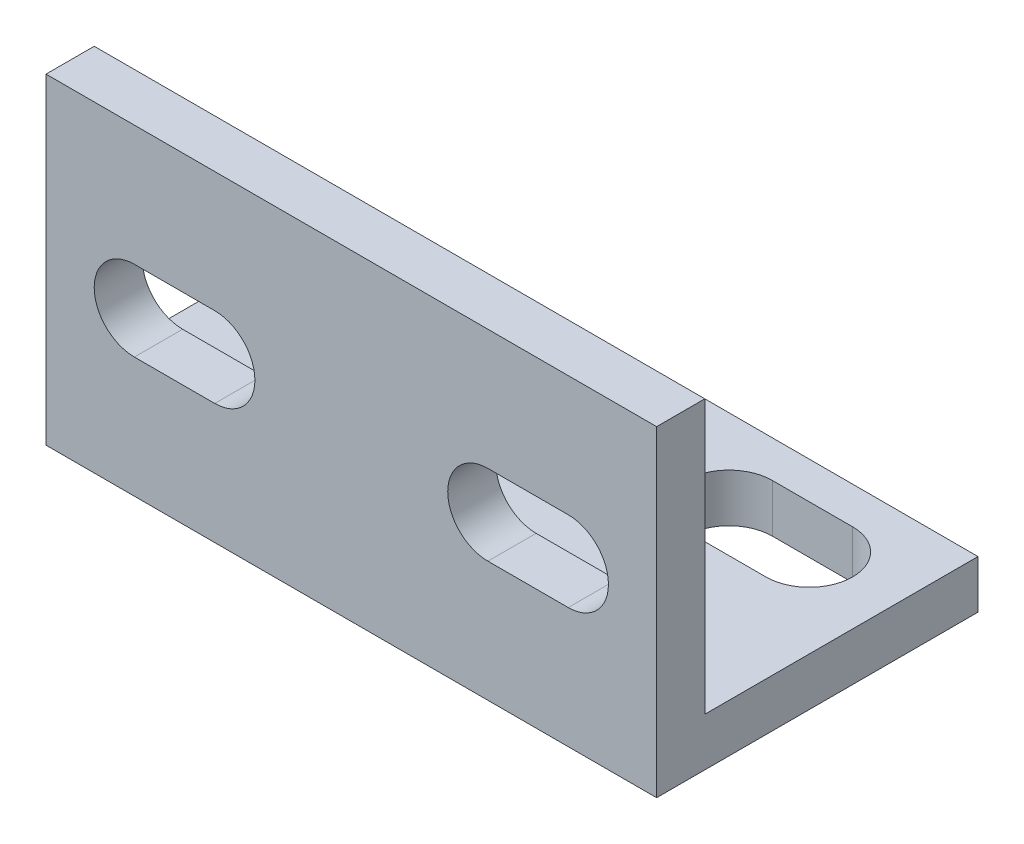
ISO-10303-21;
HEADER;
FILE_DESCRIPTION(('STEP AP214'),'2;1');
FILE_NAME('part.step','',(''),(''),'','','');
FILE_SCHEMA(('AUTOMOTIVE_DESIGN { 1 0 10303 214 1 1 1 1 }'));
ENDSEC;
DATA;
#1=APPLICATION_CONTEXT('core data for automotive mechanical design processes');
#2=APPLICATION_PROTOCOL_DEFINITION('international standard','automotive_design',2000,#1);
#3=PRODUCT_CONTEXT('',#1,'mechanical');
#4=PRODUCT('Part','Part','',(#3));
#5=PRODUCT_RELATED_PRODUCT_CATEGORY('part','',(#4));
#6=PRODUCT_DEFINITION_FORMATION('','',#4);
#7=PRODUCT_DEFINITION_CONTEXT('part definition',#1,'design');
#8=PRODUCT_DEFINITION('design','',#6,#7);
#9=PRODUCT_DEFINITION_SHAPE('','',#8);
#10=(LENGTH_UNIT() NAMED_UNIT(*) SI_UNIT(.MILLI.,.METRE.));
#11=(NAMED_UNIT(*) PLANE_ANGLE_UNIT() SI_UNIT($,.RADIAN.));
#12=(NAMED_UNIT(*) SI_UNIT($,.STERADIAN.) SOLID_ANGLE_UNIT());
#13=UNCERTAINTY_MEASURE_WITH_UNIT(LENGTH_MEASURE(1.E-05),#10,'distance_accuracy_value','');
#14=(GEOMETRIC_REPRESENTATION_CONTEXT(3) GLOBAL_UNCERTAINTY_ASSIGNED_CONTEXT((#13)) GLOBAL_UNIT_ASSIGNED_CONTEXT((#10,
#11,#12)) REPRESENTATION_CONTEXT('',''));
#15=CARTESIAN_POINT('',(0.,0.,0.));
#16=DIRECTION('',(0.,0.,1.));
#17=DIRECTION('',(1.,0.,0.));
#18=AXIS2_PLACEMENT_3D('',#15,#16,#17);
#19=CARTESIAN_POINT('',(38.,0.,0.));
#20=DIRECTION('',(0.,0.,1.));
#21=DIRECTION('',(1.,0.,0.));
#22=AXIS2_PLACEMENT_3D('',#19,#20,#21);
#23=PLANE('',#22);
#24=DIRECTION('',(0.,1.,0.));
#25=VECTOR('',#24,1.);
#26=CARTESIAN_POINT('',(0.,0.,0.));
#27=LINE('',#26,#25);
#28=CARTESIAN_POINT('',(0.,-3.,0.));
#29=VERTEX_POINT('',#28);
#30=CARTESIAN_POINT('',(0.,0.,0.));
#31=VERTEX_POINT('',#30);
#32=EDGE_CURVE('E249',#29,#31,#27,.T.);
#33=ORIENTED_EDGE('',*,*,#32,.T.);
#34=DIRECTION('',(-1.,0.,0.));
#35=VECTOR('',#34,1.);
#36=CARTESIAN_POINT('',(38.,0.,0.));
#37=LINE('',#36,#35);
#38=CARTESIAN_POINT('',(38.,0.,0.));
#39=VERTEX_POINT('',#38);
#40=EDGE_CURVE('E314',#39,#31,#37,.T.);
#41=ORIENTED_EDGE('',*,*,#40,.F.);
#42=DIRECTION('',(0.,1.,0.));
#43=VECTOR('',#42,1.);
#44=CARTESIAN_POINT('',(38.,0.,0.));
#45=LINE('',#44,#43);
#46=CARTESIAN_POINT('',(38.,-3.,0.));
#47=VERTEX_POINT('',#46);
#48=EDGE_CURVE('E274',#47,#39,#45,.T.);
#49=ORIENTED_EDGE('',*,*,#48,.F.);
#50=DIRECTION('',(-1.,0.,0.));
#51=VECTOR('',#50,1.);
#52=CARTESIAN_POINT('',(38.,-3.,0.));
#53=LINE('',#52,#51);
#54=EDGE_CURVE('E288',#47,#29,#53,.T.);
#55=ORIENTED_EDGE('',*,*,#54,.T.);
#56=EDGE_LOOP('',(#33,#41,#49,#55));
#57=FACE_BOUND('',#56,.T.);
#58=ADVANCED_FACE('F34',(#57),#23,.F.);
#59=CARTESIAN_POINT('',(38.,0.,0.));
#60=DIRECTION('',(0.,-1.,0.));
#61=DIRECTION('',(0.,0.,-1.));
#62=AXIS2_PLACEMENT_3D('',#59,#60,#61);
#63=PLANE('',#62);
#64=DIRECTION('',(1.,0.,0.));
#65=VECTOR('',#64,1.);
#66=CARTESIAN_POINT('',(5.5,0.,7.7));
#67=LINE('',#66,#65);
#68=CARTESIAN_POINT('',(5.5,0.,7.7));
#69=VERTEX_POINT('',#68);
#70=CARTESIAN_POINT('',(10.5,0.,7.7));
#71=VERTEX_POINT('',#70);
#72=EDGE_CURVE('E236',#69,#71,#67,.T.);
#73=ORIENTED_EDGE('',*,*,#72,.F.);
#74=CARTESIAN_POINT('',(5.5,0.,5.));
#75=DIRECTION('',(0.,1.,0.));
#76=DIRECTION('',(0.,0.,1.));
#77=AXIS2_PLACEMENT_3D('',#74,#75,#76);
#78=CIRCLE('',#77,2.7);
#79=CARTESIAN_POINT('',(5.5,0.,2.3));
#80=VERTEX_POINT('',#79);
#81=EDGE_CURVE('E234',#80,#69,#78,.T.);
#82=ORIENTED_EDGE('',*,*,#81,.F.);
#83=DIRECTION('',(-1.,0.,0.));
#84=VECTOR('',#83,1.);
#85=CARTESIAN_POINT('',(5.5,0.,2.3));
#86=LINE('',#85,#84);
#87=CARTESIAN_POINT('',(10.5,0.,2.3));
#88=VERTEX_POINT('',#87);
#89=EDGE_CURVE('E243',#88,#80,#86,.T.);
#90=ORIENTED_EDGE('',*,*,#89,.F.);
#91=CARTESIAN_POINT('',(10.5,0.,5.));
#92=DIRECTION('',(0.,1.,0.));
#93=DIRECTION('',(0.,0.,1.));
#94=AXIS2_PLACEMENT_3D('',#91,#92,#93);
#95=CIRCLE('',#94,2.7);
#96=EDGE_CURVE('E240',#71,#88,#95,.T.);
#97=ORIENTED_EDGE('',*,*,#96,.F.);
#98=EDGE_LOOP('',(#73,#82,#90,#97));
#99=FACE_BOUND('',#98,.T.);
#100=DIRECTION('',(-1.,0.,0.));
#101=VECTOR('',#100,1.);
#102=CARTESIAN_POINT('',(32.5,0.,2.3));
#103=LINE('',#102,#101);
#104=CARTESIAN_POINT('',(32.5,0.,2.3));
#105=VERTEX_POINT('',#104);
#106=CARTESIAN_POINT('',(27.5,0.,2.3));
#107=VERTEX_POINT('',#106);
#108=EDGE_CURVE('E257',#105,#107,#103,.T.);
#109=ORIENTED_EDGE('',*,*,#108,.F.);
#110=CARTESIAN_POINT('',(32.5,0.,5.));
#111=DIRECTION('',(0.,1.,0.));
#112=DIRECTION('',(0.,0.,-1.));
#113=AXIS2_PLACEMENT_3D('',#110,#111,#112);
#114=CIRCLE('',#113,2.7);
#115=CARTESIAN_POINT('',(32.5,0.,7.7));
#116=VERTEX_POINT('',#115);
#117=EDGE_CURVE('E213',#116,#105,#114,.T.);
#118=ORIENTED_EDGE('',*,*,#117,.F.);
#119=DIRECTION('',(1.,0.,0.));
#120=VECTOR('',#119,1.);
#121=CARTESIAN_POINT('',(32.5,0.,7.7));
#122=LINE('',#121,#120);
#123=CARTESIAN_POINT('',(27.5,0.,7.7));
#124=VERTEX_POINT('',#123);
#125=EDGE_CURVE('E263',#124,#116,#122,.T.);
#126=ORIENTED_EDGE('',*,*,#125,.F.);
#127=CARTESIAN_POINT('',(27.5,0.,5.));
#128=DIRECTION('',(0.,1.,0.));
#129=DIRECTION('',(0.,0.,-1.));
#130=AXIS2_PLACEMENT_3D('',#127,#128,#129);
#131=CIRCLE('',#130,2.7);
#132=EDGE_CURVE('E260',#107,#124,#131,.T.);
#133=ORIENTED_EDGE('',*,*,#132,.F.);
#134=EDGE_LOOP('',(#109,#118,#126,#133));
#135=FACE_BOUND('',#134,.T.);
#136=DIRECTION('',(0.,0.,1.));
#137=VECTOR('',#136,1.);
#138=CARTESIAN_POINT('',(0.,0.,0.));
#139=LINE('',#138,#137);
#140=CARTESIAN_POINT('',(0.,0.,17.));
#141=VERTEX_POINT('',#140);
#142=EDGE_CURVE('E291',#31,#141,#139,.T.);
#143=ORIENTED_EDGE('',*,*,#142,.T.);
#144=DIRECTION('',(-1.,0.,0.));
#145=VECTOR('',#144,1.);
#146=CARTESIAN_POINT('',(38.,0.,17.));
#147=LINE('',#146,#145);
#148=CARTESIAN_POINT('',(38.,0.,17.));
#149=VERTEX_POINT('',#148);
#150=EDGE_CURVE('E311',#149,#141,#147,.T.);
#151=ORIENTED_EDGE('',*,*,#150,.F.);
#152=DIRECTION('',(0.,0.,1.));
#153=VECTOR('',#152,1.);
#154=CARTESIAN_POINT('',(38.,0.,0.));
#155=LINE('',#154,#153);
#156=EDGE_CURVE('E277',#39,#149,#155,.T.);
#157=ORIENTED_EDGE('',*,*,#156,.F.);
#158=ORIENTED_EDGE('',*,*,#40,.T.);
#159=EDGE_LOOP('',(#143,#151,#157,#158));
#160=FACE_BOUND('',#159,.T.);
#161=ADVANCED_FACE('F377',(#99,#135,#160),#63,.F.);
#162=CARTESIAN_POINT('',(38.,0.,17.));
#163=DIRECTION('',(0.,0.,1.));
#164=DIRECTION('',(1.,0.,0.));
#165=AXIS2_PLACEMENT_3D('',#162,#163,#164);
#166=PLANE('',#165);
#167=DIRECTION('',(-1.,0.,0.));
#168=VECTOR('',#167,1.);
#169=CARTESIAN_POINT('',(32.5,4.49999999999999,17.));
#170=LINE('',#169,#168);
#171=CARTESIAN_POINT('',(32.5,4.49999999999999,17.));
#172=VERTEX_POINT('',#171);
#173=CARTESIAN_POINT('',(27.5,4.49999999999999,17.));
#174=VERTEX_POINT('',#173);
#175=EDGE_CURVE('E199',#172,#174,#170,.T.);
#176=ORIENTED_EDGE('',*,*,#175,.F.);
#177=CARTESIAN_POINT('',(32.5,6.99999999999999,17.));
#178=DIRECTION('',(0.,0.,-1.));
#179=DIRECTION('',(-1.,0.,0.));
#180=AXIS2_PLACEMENT_3D('',#177,#178,#179);
#181=CIRCLE('',#180,2.5);
#182=CARTESIAN_POINT('',(32.5,9.49999999999999,17.));
#183=VERTEX_POINT('',#182);
#184=EDGE_CURVE('E48',#183,#172,#181,.T.);
#185=ORIENTED_EDGE('',*,*,#184,.F.);
#186=DIRECTION('',(1.,0.,0.));
#187=VECTOR('',#186,1.);
#188=CARTESIAN_POINT('',(32.5,9.49999999999999,17.));
#189=LINE('',#188,#187);
#190=CARTESIAN_POINT('',(27.5,9.49999999999999,17.));
#191=VERTEX_POINT('',#190);
#192=EDGE_CURVE('E206',#191,#183,#189,.T.);
#193=ORIENTED_EDGE('',*,*,#192,.F.);
#194=CARTESIAN_POINT('',(27.5,6.99999999999999,17.));
#195=DIRECTION('',(0.,0.,-1.));
#196=DIRECTION('',(-1.,0.,0.));
#197=AXIS2_PLACEMENT_3D('',#194,#195,#196);
#198=CIRCLE('',#197,2.5);
#199=EDGE_CURVE('E189',#174,#191,#198,.T.);
#200=ORIENTED_EDGE('',*,*,#199,.F.);
#201=EDGE_LOOP('',(#176,#185,#193,#200));
#202=FACE_BOUND('',#201,.T.);
#203=DIRECTION('',(1.,0.,0.));
#204=VECTOR('',#203,1.);
#205=CARTESIAN_POINT('',(5.5,9.49999999999999,17.));
#206=LINE('',#205,#204);
#207=CARTESIAN_POINT('',(5.5,9.49999999999999,17.));
#208=VERTEX_POINT('',#207);
#209=CARTESIAN_POINT('',(10.5,9.49999999999999,17.));
#210=VERTEX_POINT('',#209);
#211=EDGE_CURVE('E217',#208,#210,#206,.T.);
#212=ORIENTED_EDGE('',*,*,#211,.F.);
#213=CARTESIAN_POINT('',(5.5,6.99999999999999,17.));
#214=DIRECTION('',(0.,0.,-1.));
#215=DIRECTION('',(1.,0.,0.));
#216=AXIS2_PLACEMENT_3D('',#213,#214,#215);
#217=CIRCLE('',#216,2.5);
#218=CARTESIAN_POINT('',(5.5,4.49999999999999,17.));
#219=VERTEX_POINT('',#218);
#220=EDGE_CURVE('E56',#219,#208,#217,.T.);
#221=ORIENTED_EDGE('',*,*,#220,.F.);
#222=DIRECTION('',(-1.,0.,0.));
#223=VECTOR('',#222,1.);
#224=CARTESIAN_POINT('',(5.5,4.49999999999999,17.));
#225=LINE('',#224,#223);
#226=CARTESIAN_POINT('',(10.5,4.49999999999999,17.));
#227=VERTEX_POINT('',#226);
#228=EDGE_CURVE('E223',#227,#219,#225,.T.);
#229=ORIENTED_EDGE('',*,*,#228,.F.);
#230=CARTESIAN_POINT('',(10.5,6.99999999999999,17.));
#231=DIRECTION('',(0.,0.,-1.));
#232=DIRECTION('',(1.,0.,0.));
#233=AXIS2_PLACEMENT_3D('',#230,#231,#232);
#234=CIRCLE('',#233,2.5);
#235=EDGE_CURVE('E220',#210,#227,#234,.T.);
#236=ORIENTED_EDGE('',*,*,#235,.F.);
#237=EDGE_LOOP('',(#212,#221,#229,#236));
#238=FACE_BOUND('',#237,.T.);
#239=DIRECTION('',(0.,1.,0.));
#240=VECTOR('',#239,1.);
#241=CARTESIAN_POINT('',(0.,0.,17.));
#242=LINE('',#241,#240);
#243=CARTESIAN_POINT('',(0.,17.,17.));
#244=VERTEX_POINT('',#243);
#245=EDGE_CURVE('E293',#141,#244,#242,.T.);
#246=ORIENTED_EDGE('',*,*,#245,.T.);
#247=DIRECTION('',(-1.,0.,0.));
#248=VECTOR('',#247,1.);
#249=CARTESIAN_POINT('',(38.,17.,17.));
#250=LINE('',#249,#248);
#251=CARTESIAN_POINT('',(38.,17.,17.));
#252=VERTEX_POINT('',#251);
#253=EDGE_CURVE('E308',#252,#244,#250,.T.);
#254=ORIENTED_EDGE('',*,*,#253,.F.);
#255=DIRECTION('',(0.,1.,0.));
#256=VECTOR('',#255,1.);
#257=CARTESIAN_POINT('',(38.,0.,17.));
#258=LINE('',#257,#256);
#259=EDGE_CURVE('E280',#149,#252,#258,.T.);
#260=ORIENTED_EDGE('',*,*,#259,.F.);
#261=ORIENTED_EDGE('',*,*,#150,.T.);
#262=EDGE_LOOP('',(#246,#254,#260,#261));
#263=FACE_BOUND('',#262,.T.);
#264=ADVANCED_FACE('F203',(#202,#238,#263),#166,.F.);
#265=CARTESIAN_POINT('',(38.,17.,17.));
#266=DIRECTION('',(0.,-1.,0.));
#267=DIRECTION('',(0.,0.,-1.));
#268=AXIS2_PLACEMENT_3D('',#265,#266,#267);
#269=PLANE('',#268);
#270=DIRECTION('',(0.,0.,1.));
#271=VECTOR('',#270,1.);
#272=CARTESIAN_POINT('',(0.,17.,17.));
#273=LINE('',#272,#271);
#274=CARTESIAN_POINT('',(0.,17.,20.));
#275=VERTEX_POINT('',#274);
#276=EDGE_CURVE('E295',#244,#275,#273,.T.);
#277=ORIENTED_EDGE('',*,*,#276,.T.);
#278=DIRECTION('',(-1.,0.,0.));
#279=VECTOR('',#278,1.);
#280=CARTESIAN_POINT('',(38.,17.,20.));
#281=LINE('',#280,#279);
#282=CARTESIAN_POINT('',(38.,17.,20.));
#283=VERTEX_POINT('',#282);
#284=EDGE_CURVE('E305',#283,#275,#281,.T.);
#285=ORIENTED_EDGE('',*,*,#284,.F.);
#286=DIRECTION('',(0.,0.,1.));
#287=VECTOR('',#286,1.);
#288=CARTESIAN_POINT('',(38.,17.,17.));
#289=LINE('',#288,#287);
#290=EDGE_CURVE('E282',#252,#283,#289,.T.);
#291=ORIENTED_EDGE('',*,*,#290,.F.);
#292=ORIENTED_EDGE('',*,*,#253,.T.);
#293=EDGE_LOOP('',(#277,#285,#291,#292));
#294=FACE_BOUND('',#293,.T.);
#295=ADVANCED_FACE('F406',(#294),#269,.F.);
#296=CARTESIAN_POINT('',(38.,17.,20.));
#297=DIRECTION('',(0.,0.,-1.));
#298=DIRECTION('',(0.,1.,0.));
#299=AXIS2_PLACEMENT_3D('',#296,#297,#298);
#300=PLANE('',#299);
#301=DIRECTION('',(1.,0.,0.));
#302=VECTOR('',#301,1.);
#303=CARTESIAN_POINT('',(38.,9.49999999999999,20.));
#304=LINE('',#303,#302);
#305=CARTESIAN_POINT('',(27.5,9.49999999999999,20.));
#306=VERTEX_POINT('',#305);
#307=CARTESIAN_POINT('',(32.5,9.49999999999999,20.));
#308=VERTEX_POINT('',#307);
#309=EDGE_CURVE('E41',#306,#308,#304,.T.);
#310=ORIENTED_EDGE('',*,*,#309,.T.);
#311=CARTESIAN_POINT('',(32.5,6.99999999999999,20.));
#312=DIRECTION('',(0.,0.,-1.));
#313=DIRECTION('',(0.,1.,0.));
#314=AXIS2_PLACEMENT_3D('',#311,#312,#313);
#315=CIRCLE('',#314,2.5);
#316=CARTESIAN_POINT('',(32.5,4.49999999999999,20.));
#317=VERTEX_POINT('',#316);
#318=EDGE_CURVE('E11',#308,#317,#315,.T.);
#319=ORIENTED_EDGE('',*,*,#318,.T.);
#320=DIRECTION('',(-1.,0.,0.));
#321=VECTOR('',#320,1.);
#322=CARTESIAN_POINT('',(38.,4.49999999999999,20.));
#323=LINE('',#322,#321);
#324=CARTESIAN_POINT('',(27.5,4.49999999999999,20.));
#325=VERTEX_POINT('',#324);
#326=EDGE_CURVE('E353',#317,#325,#323,.T.);
#327=ORIENTED_EDGE('',*,*,#326,.T.);
#328=CARTESIAN_POINT('',(27.5,6.99999999999999,20.));
#329=DIRECTION('',(0.,0.,-1.));
#330=DIRECTION('',(0.,1.,0.));
#331=AXIS2_PLACEMENT_3D('',#328,#329,#330);
#332=CIRCLE('',#331,2.5);
#333=EDGE_CURVE('E192',#325,#306,#332,.T.);
#334=ORIENTED_EDGE('',*,*,#333,.T.);
#335=EDGE_LOOP('',(#310,#319,#327,#334));
#336=FACE_BOUND('',#335,.T.);
#337=DIRECTION('',(-1.,0.,0.));
#338=VECTOR('',#337,1.);
#339=CARTESIAN_POINT('',(38.,4.49999999999999,20.));
#340=LINE('',#339,#338);
#341=CARTESIAN_POINT('',(10.5,4.49999999999999,20.));
#342=VERTEX_POINT('',#341);
#343=CARTESIAN_POINT('',(5.5,4.49999999999999,20.));
#344=VERTEX_POINT('',#343);
#345=EDGE_CURVE('E347',#342,#344,#340,.T.);
#346=ORIENTED_EDGE('',*,*,#345,.T.);
#347=CARTESIAN_POINT('',(5.5,6.99999999999999,20.));
#348=DIRECTION('',(0.,0.,-1.));
#349=DIRECTION('',(0.,1.,0.));
#350=AXIS2_PLACEMENT_3D('',#347,#348,#349);
#351=CIRCLE('',#350,2.5);
#352=CARTESIAN_POINT('',(5.5,9.49999999999999,20.));
#353=VERTEX_POINT('',#352);
#354=EDGE_CURVE('E350',#344,#353,#351,.T.);
#355=ORIENTED_EDGE('',*,*,#354,.T.);
#356=DIRECTION('',(1.,0.,0.));
#357=VECTOR('',#356,1.);
#358=CARTESIAN_POINT('',(38.,9.49999999999999,20.));
#359=LINE('',#358,#357);
#360=CARTESIAN_POINT('',(10.5,9.49999999999999,20.));
#361=VERTEX_POINT('',#360);
#362=EDGE_CURVE('E341',#353,#361,#359,.T.);
#363=ORIENTED_EDGE('',*,*,#362,.T.);
#364=CARTESIAN_POINT('',(10.5,6.99999999999999,20.));
#365=DIRECTION('',(0.,0.,-1.));
#366=DIRECTION('',(0.,1.,0.));
#367=AXIS2_PLACEMENT_3D('',#364,#365,#366);
#368=CIRCLE('',#367,2.5);
#369=EDGE_CURVE('E344',#361,#342,#368,.T.);
#370=ORIENTED_EDGE('',*,*,#369,.T.);
#371=EDGE_LOOP('',(#346,#355,#363,#370));
#372=FACE_BOUND('',#371,.T.);
#373=DIRECTION('',(0.,-1.,0.));
#374=VECTOR('',#373,1.);
#375=CARTESIAN_POINT('',(0.,17.,20.));
#376=LINE('',#375,#374);
#377=CARTESIAN_POINT('',(0.,-3.,20.));
#378=VERTEX_POINT('',#377);
#379=EDGE_CURVE('E297',#275,#378,#376,.T.);
#380=ORIENTED_EDGE('',*,*,#379,.T.);
#381=DIRECTION('',(-1.,0.,0.));
#382=VECTOR('',#381,1.);
#383=CARTESIAN_POINT('',(38.,-3.,20.));
#384=LINE('',#383,#382);
#385=CARTESIAN_POINT('',(38.,-3.,20.));
#386=VERTEX_POINT('',#385);
#387=EDGE_CURVE('E302',#386,#378,#384,.T.);
#388=ORIENTED_EDGE('',*,*,#387,.F.);
#389=DIRECTION('',(0.,-1.,0.));
#390=VECTOR('',#389,1.);
#391=CARTESIAN_POINT('',(38.,17.,20.));
#392=LINE('',#391,#390);
#393=EDGE_CURVE('E284',#283,#386,#392,.T.);
#394=ORIENTED_EDGE('',*,*,#393,.F.);
#395=ORIENTED_EDGE('',*,*,#284,.T.);
#396=EDGE_LOOP('',(#380,#388,#394,#395));
#397=FACE_BOUND('',#396,.T.);
#398=ADVANCED_FACE('F357',(#336,#372,#397),#300,.F.);
#399=CARTESIAN_POINT('',(38.,-3.,0.));
#400=DIRECTION('',(0.,1.,0.));
#401=DIRECTION('',(0.,0.,1.));
#402=AXIS2_PLACEMENT_3D('',#399,#400,#401);
#403=PLANE('',#402);
#404=DIRECTION('',(-1.,0.,0.));
#405=VECTOR('',#404,1.);
#406=CARTESIAN_POINT('',(38.,-3.,2.3));
#407=LINE('',#406,#405);
#408=CARTESIAN_POINT('',(10.5,-3.,2.3));
#409=VERTEX_POINT('',#408);
#410=CARTESIAN_POINT('',(5.5,-3.,2.3));
#411=VERTEX_POINT('',#410);
#412=EDGE_CURVE('E335',#409,#411,#407,.T.);
#413=ORIENTED_EDGE('',*,*,#412,.T.);
#414=CARTESIAN_POINT('',(5.5,-3.,5.));
#415=DIRECTION('',(0.,1.,0.));
#416=DIRECTION('',(0.,0.,1.));
#417=AXIS2_PLACEMENT_3D('',#414,#415,#416);
#418=CIRCLE('',#417,2.7);
#419=CARTESIAN_POINT('',(5.5,-3.,7.7));
#420=VERTEX_POINT('',#419);
#421=EDGE_CURVE('E338',#411,#420,#418,.T.);
#422=ORIENTED_EDGE('',*,*,#421,.T.);
#423=DIRECTION('',(1.,0.,0.));
#424=VECTOR('',#423,1.);
#425=CARTESIAN_POINT('',(38.,-3.,7.7));
#426=LINE('',#425,#424);
#427=CARTESIAN_POINT('',(10.5,-3.,7.7));
#428=VERTEX_POINT('',#427);
#429=EDGE_CURVE('E329',#420,#428,#426,.T.);
#430=ORIENTED_EDGE('',*,*,#429,.T.);
#431=CARTESIAN_POINT('',(10.5,-3.,5.));
#432=DIRECTION('',(0.,1.,0.));
#433=DIRECTION('',(0.,0.,1.));
#434=AXIS2_PLACEMENT_3D('',#431,#432,#433);
#435=CIRCLE('',#434,2.7);
#436=EDGE_CURVE('E332',#428,#409,#435,.T.);
#437=ORIENTED_EDGE('',*,*,#436,.T.);
#438=EDGE_LOOP('',(#413,#422,#430,#437));
#439=FACE_BOUND('',#438,.T.);
#440=DIRECTION('',(1.,0.,0.));
#441=VECTOR('',#440,1.);
#442=CARTESIAN_POINT('',(38.,-3.,7.7));
#443=LINE('',#442,#441);
#444=CARTESIAN_POINT('',(27.5,-3.,7.7));
#445=VERTEX_POINT('',#444);
#446=CARTESIAN_POINT('',(32.5,-3.,7.7));
#447=VERTEX_POINT('',#446);
#448=EDGE_CURVE('E323',#445,#447,#443,.T.);
#449=ORIENTED_EDGE('',*,*,#448,.T.);
#450=CARTESIAN_POINT('',(32.5,-3.,5.));
#451=DIRECTION('',(0.,1.,0.));
#452=DIRECTION('',(0.,0.,1.));
#453=AXIS2_PLACEMENT_3D('',#450,#451,#452);
#454=CIRCLE('',#453,2.7);
#455=CARTESIAN_POINT('',(32.5,-3.,2.3));
#456=VERTEX_POINT('',#455);
#457=EDGE_CURVE('E326',#447,#456,#454,.T.);
#458=ORIENTED_EDGE('',*,*,#457,.T.);
#459=DIRECTION('',(-1.,0.,0.));
#460=VECTOR('',#459,1.);
#461=CARTESIAN_POINT('',(38.,-3.,2.3));
#462=LINE('',#461,#460);
#463=CARTESIAN_POINT('',(27.5,-3.,2.3));
#464=VERTEX_POINT('',#463);
#465=EDGE_CURVE('E317',#456,#464,#462,.T.);
#466=ORIENTED_EDGE('',*,*,#465,.T.);
#467=CARTESIAN_POINT('',(27.5,-3.,5.));
#468=DIRECTION('',(0.,1.,0.));
#469=DIRECTION('',(0.,0.,1.));
#470=AXIS2_PLACEMENT_3D('',#467,#468,#469);
#471=CIRCLE('',#470,2.7);
#472=EDGE_CURVE('E320',#464,#445,#471,.T.);
#473=ORIENTED_EDGE('',*,*,#472,.T.);
#474=EDGE_LOOP('',(#449,#458,#466,#473));
#475=FACE_BOUND('',#474,.T.);
#476=DIRECTION('',(0.,0.,-1.));
#477=VECTOR('',#476,1.);
#478=CARTESIAN_POINT('',(0.,-3.,0.));
#479=LINE('',#478,#477);
#480=EDGE_CURVE('E278',#378,#29,#479,.T.);
#481=ORIENTED_EDGE('',*,*,#480,.T.);
#482=ORIENTED_EDGE('',*,*,#54,.F.);
#483=DIRECTION('',(0.,0.,-1.));
#484=VECTOR('',#483,1.);
#485=CARTESIAN_POINT('',(38.,-3.,0.));
#486=LINE('',#485,#484);
#487=EDGE_CURVE('E286',#386,#47,#486,.T.);
#488=ORIENTED_EDGE('',*,*,#487,.F.);
#489=ORIENTED_EDGE('',*,*,#387,.T.);
#490=EDGE_LOOP('',(#481,#482,#488,#489));
#491=FACE_BOUND('',#490,.T.);
#492=ADVANCED_FACE('F402',(#439,#475,#491),#403,.F.);
#493=CARTESIAN_POINT('',(38.,0.,0.));
#494=DIRECTION('',(-1.,0.,0.));
#495=DIRECTION('',(0.,0.,1.));
#496=AXIS2_PLACEMENT_3D('',#493,#494,#495);
#497=PLANE('',#496);
#498=ORIENTED_EDGE('',*,*,#48,.T.);
#499=ORIENTED_EDGE('',*,*,#156,.T.);
#500=ORIENTED_EDGE('',*,*,#259,.T.);
#501=ORIENTED_EDGE('',*,*,#290,.T.);
#502=ORIENTED_EDGE('',*,*,#393,.T.);
#503=ORIENTED_EDGE('',*,*,#487,.T.);
#504=EDGE_LOOP('',(#498,#499,#500,#501,#502,#503));
#505=FACE_BOUND('',#504,.T.);
#506=ADVANCED_FACE('F397',(#505),#497,.F.);
#507=CARTESIAN_POINT('',(0.,0.,0.));
#508=DIRECTION('',(-1.,0.,0.));
#509=DIRECTION('',(0.,0.,1.));
#510=AXIS2_PLACEMENT_3D('',#507,#508,#509);
#511=PLANE('',#510);
#512=ORIENTED_EDGE('',*,*,#32,.F.);
#513=ORIENTED_EDGE('',*,*,#480,.F.);
#514=ORIENTED_EDGE('',*,*,#379,.F.);
#515=ORIENTED_EDGE('',*,*,#276,.F.);
#516=ORIENTED_EDGE('',*,*,#245,.F.);
#517=ORIENTED_EDGE('',*,*,#142,.F.);
#518=EDGE_LOOP('',(#512,#513,#514,#515,#516,#517));
#519=FACE_BOUND('',#518,.T.);
#520=ADVANCED_FACE('F389',(#519),#511,.T.);
#521=CARTESIAN_POINT('',(32.5,-4.,5.));
#522=DIRECTION('',(0.,1.,0.));
#523=DIRECTION('',(0.,0.,1.));
#524=AXIS2_PLACEMENT_3D('',#521,#522,#523);
#525=CYLINDRICAL_SURFACE('',#524,2.7);
#526=DIRECTION('',(0.,1.,0.));
#527=VECTOR('',#526,1.);
#528=CARTESIAN_POINT('',(32.5,-4.,7.7));
#529=LINE('',#528,#527);
#530=EDGE_CURVE('E237',#447,#116,#529,.T.);
#531=ORIENTED_EDGE('',*,*,#530,.T.);
#532=ORIENTED_EDGE('',*,*,#117,.T.);
#533=DIRECTION('',(0.,1.,0.));
#534=VECTOR('',#533,1.);
#535=CARTESIAN_POINT('',(32.5,-4.,2.3));
#536=LINE('',#535,#534);
#537=EDGE_CURVE('E266',#456,#105,#536,.T.);
#538=ORIENTED_EDGE('',*,*,#537,.F.);
#539=ORIENTED_EDGE('',*,*,#457,.F.);
#540=EDGE_LOOP('',(#531,#532,#538,#539));
#541=FACE_BOUND('',#540,.T.);
#542=ADVANCED_FACE('F424',(#541),#525,.F.);
#543=CARTESIAN_POINT('',(32.5,-4.,7.7));
#544=DIRECTION('',(0.,0.,1.));
#545=DIRECTION('',(0.,-1.,0.));
#546=AXIS2_PLACEMENT_3D('',#543,#544,#545);
#547=PLANE('',#546);
#548=DIRECTION('',(0.,1.,0.));
#549=VECTOR('',#548,1.);
#550=CARTESIAN_POINT('',(27.5,-4.,7.7));
#551=LINE('',#550,#549);
#552=EDGE_CURVE('E268',#445,#124,#551,.T.);
#553=ORIENTED_EDGE('',*,*,#552,.T.);
#554=ORIENTED_EDGE('',*,*,#125,.T.);
#555=ORIENTED_EDGE('',*,*,#530,.F.);
#556=ORIENTED_EDGE('',*,*,#448,.F.);
#557=EDGE_LOOP('',(#553,#554,#555,#556));
#558=FACE_BOUND('',#557,.T.);
#559=ADVANCED_FACE('F429',(#558),#547,.F.);
#560=CARTESIAN_POINT('',(27.5,-4.,5.));
#561=DIRECTION('',(0.,1.,0.));
#562=DIRECTION('',(0.,0.,1.));
#563=AXIS2_PLACEMENT_3D('',#560,#561,#562);
#564=CYLINDRICAL_SURFACE('',#563,2.7);
#565=DIRECTION('',(0.,1.,0.));
#566=VECTOR('',#565,1.);
#567=CARTESIAN_POINT('',(27.5,-4.,2.3));
#568=LINE('',#567,#566);
#569=EDGE_CURVE('E270',#464,#107,#568,.T.);
#570=ORIENTED_EDGE('',*,*,#569,.T.);
#571=ORIENTED_EDGE('',*,*,#132,.T.);
#572=ORIENTED_EDGE('',*,*,#552,.F.);
#573=ORIENTED_EDGE('',*,*,#472,.F.);
#574=EDGE_LOOP('',(#570,#571,#572,#573));
#575=FACE_BOUND('',#574,.T.);
#576=ADVANCED_FACE('F435',(#575),#564,.F.);
#577=CARTESIAN_POINT('',(32.5,-4.,2.3));
#578=DIRECTION('',(0.,0.,-1.));
#579=DIRECTION('',(0.,1.,0.));
#580=AXIS2_PLACEMENT_3D('',#577,#578,#579);
#581=PLANE('',#580);
#582=ORIENTED_EDGE('',*,*,#537,.T.);
#583=ORIENTED_EDGE('',*,*,#108,.T.);
#584=ORIENTED_EDGE('',*,*,#569,.F.);
#585=ORIENTED_EDGE('',*,*,#465,.F.);
#586=EDGE_LOOP('',(#582,#583,#584,#585));
#587=FACE_BOUND('',#586,.T.);
#588=ADVANCED_FACE('F431',(#587),#581,.F.);
#589=CARTESIAN_POINT('',(5.5,-4.,5.));
#590=DIRECTION('',(0.,1.,0.));
#591=DIRECTION('',(0.,0.,1.));
#592=AXIS2_PLACEMENT_3D('',#589,#590,#591);
#593=CYLINDRICAL_SURFACE('',#592,2.7);
#594=DIRECTION('',(0.,1.,0.));
#595=VECTOR('',#594,1.);
#596=CARTESIAN_POINT('',(5.5,-4.,2.3));
#597=LINE('',#596,#595);
#598=EDGE_CURVE('E247',#411,#80,#597,.T.);
#599=ORIENTED_EDGE('',*,*,#598,.T.);
#600=ORIENTED_EDGE('',*,*,#81,.T.);
#601=DIRECTION('',(0.,1.,0.));
#602=VECTOR('',#601,1.);
#603=CARTESIAN_POINT('',(5.5,-4.,7.7));
#604=LINE('',#603,#602);
#605=EDGE_CURVE('E246',#420,#69,#604,.T.);
#606=ORIENTED_EDGE('',*,*,#605,.F.);
#607=ORIENTED_EDGE('',*,*,#421,.F.);
#608=EDGE_LOOP('',(#599,#600,#606,#607));
#609=FACE_BOUND('',#608,.T.);
#610=ADVANCED_FACE('F434',(#609),#593,.F.);
#611=CARTESIAN_POINT('',(5.5,-4.,2.3));
#612=DIRECTION('',(0.,0.,-1.));
#613=DIRECTION('',(0.,1.,0.));
#614=AXIS2_PLACEMENT_3D('',#611,#612,#613);
#615=PLANE('',#614);
#616=DIRECTION('',(0.,1.,0.));
#617=VECTOR('',#616,1.);
#618=CARTESIAN_POINT('',(10.5,-4.,2.3));
#619=LINE('',#618,#617);
#620=EDGE_CURVE('E250',#409,#88,#619,.T.);
#621=ORIENTED_EDGE('',*,*,#620,.T.);
#622=ORIENTED_EDGE('',*,*,#89,.T.);
#623=ORIENTED_EDGE('',*,*,#598,.F.);
#624=ORIENTED_EDGE('',*,*,#412,.F.);
#625=EDGE_LOOP('',(#621,#622,#623,#624));
#626=FACE_BOUND('',#625,.T.);
#627=ADVANCED_FACE('F445',(#626),#615,.F.);
#628=CARTESIAN_POINT('',(10.5,-4.,5.));
#629=DIRECTION('',(0.,1.,0.));
#630=DIRECTION('',(0.,0.,1.));
#631=AXIS2_PLACEMENT_3D('',#628,#629,#630);
#632=CYLINDRICAL_SURFACE('',#631,2.7);
#633=DIRECTION('',(0.,1.,0.));
#634=VECTOR('',#633,1.);
#635=CARTESIAN_POINT('',(10.5,-4.,7.7));
#636=LINE('',#635,#634);
#637=EDGE_CURVE('E252',#428,#71,#636,.T.);
#638=ORIENTED_EDGE('',*,*,#637,.T.);
#639=ORIENTED_EDGE('',*,*,#96,.T.);
#640=ORIENTED_EDGE('',*,*,#620,.F.);
#641=ORIENTED_EDGE('',*,*,#436,.F.);
#642=EDGE_LOOP('',(#638,#639,#640,#641));
#643=FACE_BOUND('',#642,.T.);
#644=ADVANCED_FACE('F451',(#643),#632,.F.);
#645=CARTESIAN_POINT('',(5.5,-4.,7.7));
#646=DIRECTION('',(0.,0.,1.));
#647=DIRECTION('',(0.,-1.,0.));
#648=AXIS2_PLACEMENT_3D('',#645,#646,#647);
#649=PLANE('',#648);
#650=ORIENTED_EDGE('',*,*,#605,.T.);
#651=ORIENTED_EDGE('',*,*,#72,.T.);
#652=ORIENTED_EDGE('',*,*,#637,.F.);
#653=ORIENTED_EDGE('',*,*,#429,.F.);
#654=EDGE_LOOP('',(#650,#651,#652,#653));
#655=FACE_BOUND('',#654,.T.);
#656=ADVANCED_FACE('F447',(#655),#649,.F.);
#657=CARTESIAN_POINT('',(5.5,6.99999999999999,21.));
#658=DIRECTION('',(0.,0.,-1.));
#659=DIRECTION('',(-1.,0.,0.));
#660=AXIS2_PLACEMENT_3D('',#657,#658,#659);
#661=CYLINDRICAL_SURFACE('',#660,2.5);
#662=DIRECTION('',(0.,0.,-1.));
#663=VECTOR('',#662,1.);
#664=CARTESIAN_POINT('',(5.5,4.49999999999999,21.));
#665=LINE('',#664,#663);
#666=EDGE_CURVE('E227',#344,#219,#665,.T.);
#667=ORIENTED_EDGE('',*,*,#666,.T.);
#668=ORIENTED_EDGE('',*,*,#220,.T.);
#669=DIRECTION('',(0.,0.,-1.));
#670=VECTOR('',#669,1.);
#671=CARTESIAN_POINT('',(5.5,9.49999999999999,21.));
#672=LINE('',#671,#670);
#673=EDGE_CURVE('E226',#353,#208,#672,.T.);
#674=ORIENTED_EDGE('',*,*,#673,.F.);
#675=ORIENTED_EDGE('',*,*,#354,.F.);
#676=EDGE_LOOP('',(#667,#668,#674,#675));
#677=FACE_BOUND('',#676,.T.);
#678=ADVANCED_FACE('F450',(#677),#661,.F.);
#679=CARTESIAN_POINT('',(5.5,4.49999999999999,21.));
#680=DIRECTION('',(0.,-1.,0.));
#681=DIRECTION('',(0.,0.,-1.));
#682=AXIS2_PLACEMENT_3D('',#679,#680,#681);
#683=PLANE('',#682);
#684=DIRECTION('',(0.,0.,-1.));
#685=VECTOR('',#684,1.);
#686=CARTESIAN_POINT('',(10.5,4.49999999999999,21.));
#687=LINE('',#686,#685);
#688=EDGE_CURVE('E229',#342,#227,#687,.T.);
#689=ORIENTED_EDGE('',*,*,#688,.T.);
#690=ORIENTED_EDGE('',*,*,#228,.T.);
#691=ORIENTED_EDGE('',*,*,#666,.F.);
#692=ORIENTED_EDGE('',*,*,#345,.F.);
#693=EDGE_LOOP('',(#689,#690,#691,#692));
#694=FACE_BOUND('',#693,.T.);
#695=ADVANCED_FACE('F460',(#694),#683,.F.);
#696=CARTESIAN_POINT('',(10.5,6.99999999999999,21.));
#697=DIRECTION('',(0.,0.,-1.));
#698=DIRECTION('',(-1.,0.,0.));
#699=AXIS2_PLACEMENT_3D('',#696,#697,#698);
#700=CYLINDRICAL_SURFACE('',#699,2.5);
#701=DIRECTION('',(0.,0.,-1.));
#702=VECTOR('',#701,1.);
#703=CARTESIAN_POINT('',(10.5,9.49999999999999,21.));
#704=LINE('',#703,#702);
#705=EDGE_CURVE('E231',#361,#210,#704,.T.);
#706=ORIENTED_EDGE('',*,*,#705,.T.);
#707=ORIENTED_EDGE('',*,*,#235,.T.);
#708=ORIENTED_EDGE('',*,*,#688,.F.);
#709=ORIENTED_EDGE('',*,*,#369,.F.);
#710=EDGE_LOOP('',(#706,#707,#708,#709));
#711=FACE_BOUND('',#710,.T.);
#712=ADVANCED_FACE('F371',(#711),#700,.F.);
#713=CARTESIAN_POINT('',(5.5,9.49999999999999,21.));
#714=DIRECTION('',(0.,1.,0.));
#715=DIRECTION('',(0.,0.,1.));
#716=AXIS2_PLACEMENT_3D('',#713,#714,#715);
#717=PLANE('',#716);
#718=ORIENTED_EDGE('',*,*,#673,.T.);
#719=ORIENTED_EDGE('',*,*,#211,.T.);
#720=ORIENTED_EDGE('',*,*,#705,.F.);
#721=ORIENTED_EDGE('',*,*,#362,.F.);
#722=EDGE_LOOP('',(#718,#719,#720,#721));
#723=FACE_BOUND('',#722,.T.);
#724=ADVANCED_FACE('F364',(#723),#717,.F.);
#725=CARTESIAN_POINT('',(32.5,6.99999999999999,21.));
#726=DIRECTION('',(0.,0.,-1.));
#727=DIRECTION('',(-1.,0.,0.));
#728=AXIS2_PLACEMENT_3D('',#725,#726,#727);
#729=CYLINDRICAL_SURFACE('',#728,2.5);
#730=DIRECTION('',(0.,0.,-1.));
#731=VECTOR('',#730,1.);
#732=CARTESIAN_POINT('',(32.5,9.49999999999999,21.));
#733=LINE('',#732,#731);
#734=EDGE_CURVE('E211',#308,#183,#733,.T.);
#735=ORIENTED_EDGE('',*,*,#734,.T.);
#736=ORIENTED_EDGE('',*,*,#184,.T.);
#737=DIRECTION('',(0.,0.,-1.));
#738=VECTOR('',#737,1.);
#739=CARTESIAN_POINT('',(32.5,4.49999999999999,21.));
#740=LINE('',#739,#738);
#741=EDGE_CURVE('E196',#317,#172,#740,.T.);
#742=ORIENTED_EDGE('',*,*,#741,.F.);
#743=ORIENTED_EDGE('',*,*,#318,.F.);
#744=EDGE_LOOP('',(#735,#736,#742,#743));
#745=FACE_BOUND('',#744,.T.);
#746=ADVANCED_FACE('F362',(#745),#729,.F.);
#747=CARTESIAN_POINT('',(32.5,9.49999999999999,21.));
#748=DIRECTION('',(0.,1.,0.));
#749=DIRECTION('',(0.,0.,1.));
#750=AXIS2_PLACEMENT_3D('',#747,#748,#749);
#751=PLANE('',#750);
#752=DIRECTION('',(0.,0.,-1.));
#753=VECTOR('',#752,1.);
#754=CARTESIAN_POINT('',(27.5,9.49999999999999,21.));
#755=LINE('',#754,#753);
#756=EDGE_CURVE('E195',#306,#191,#755,.T.);
#757=ORIENTED_EDGE('',*,*,#756,.T.);
#758=ORIENTED_EDGE('',*,*,#192,.T.);
#759=ORIENTED_EDGE('',*,*,#734,.F.);
#760=ORIENTED_EDGE('',*,*,#309,.F.);
#761=EDGE_LOOP('',(#757,#758,#759,#760));
#762=FACE_BOUND('',#761,.T.);
#763=ADVANCED_FACE('F361',(#762),#751,.F.);
#764=CARTESIAN_POINT('',(27.5,6.99999999999999,21.));
#765=DIRECTION('',(0.,0.,-1.));
#766=DIRECTION('',(-1.,0.,0.));
#767=AXIS2_PLACEMENT_3D('',#764,#765,#766);
#768=CYLINDRICAL_SURFACE('',#767,2.5);
#769=DIRECTION('',(0.,0.,-1.));
#770=VECTOR('',#769,1.);
#771=CARTESIAN_POINT('',(27.5,4.49999999999999,21.));
#772=LINE('',#771,#770);
#773=EDGE_CURVE('E184',#325,#174,#772,.T.);
#774=ORIENTED_EDGE('',*,*,#773,.T.);
#775=ORIENTED_EDGE('',*,*,#199,.T.);
#776=ORIENTED_EDGE('',*,*,#756,.F.);
#777=ORIENTED_EDGE('',*,*,#333,.F.);
#778=EDGE_LOOP('',(#774,#775,#776,#777));
#779=FACE_BOUND('',#778,.T.);
#780=ADVANCED_FACE('F186',(#779),#768,.F.);
#781=CARTESIAN_POINT('',(32.5,4.49999999999999,21.));
#782=DIRECTION('',(0.,-1.,0.));
#783=DIRECTION('',(0.,0.,-1.));
#784=AXIS2_PLACEMENT_3D('',#781,#782,#783);
#785=PLANE('',#784);
#786=ORIENTED_EDGE('',*,*,#741,.T.);
#787=ORIENTED_EDGE('',*,*,#175,.T.);
#788=ORIENTED_EDGE('',*,*,#773,.F.);
#789=ORIENTED_EDGE('',*,*,#326,.F.);
#790=EDGE_LOOP('',(#786,#787,#788,#789));
#791=FACE_BOUND('',#790,.T.);
#792=ADVANCED_FACE('F200',(#791),#785,.F.);
#793=CLOSED_SHELL('',(#58,#161,#264,#295,#398,#492,#506,#520,#542,#559,#576,#588,#610,#627,#644,
#656,#678,#695,#712,#724,#746,#763,#780,#792));
#794=MANIFOLD_SOLID_BREP('B2',#793);
#795=ADVANCED_BREP_SHAPE_REPRESENTATION('',(#18,#794),#14);
#796=SHAPE_DEFINITION_REPRESENTATION(#9,#795);
ENDSEC;
END-ISO-10303-21;
